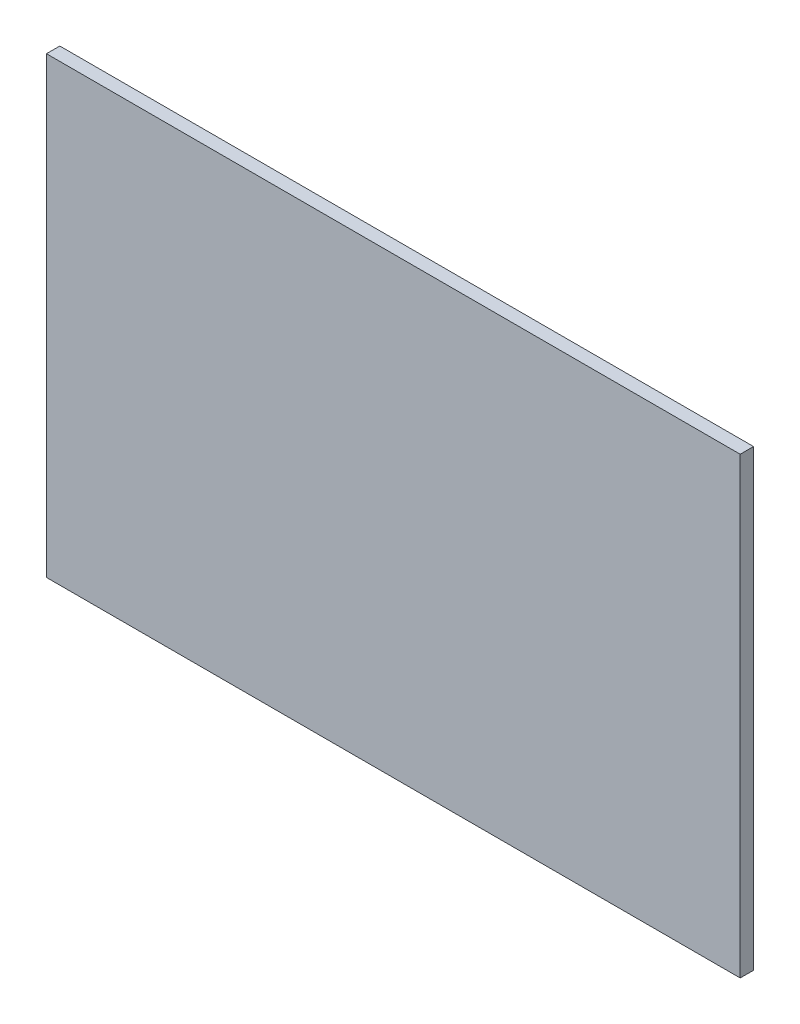
ISO-10303-21;
HEADER;
FILE_DESCRIPTION(('STEP AP214'),'2;1');
FILE_NAME('part.step','',(''),(''),'','','');
FILE_SCHEMA(('AUTOMOTIVE_DESIGN { 1 0 10303 214 1 1 1 1 }'));
ENDSEC;
DATA;
#1=APPLICATION_CONTEXT('core data for automotive mechanical design processes');
#2=APPLICATION_PROTOCOL_DEFINITION('international standard','automotive_design',2000,#1);
#3=PRODUCT_CONTEXT('',#1,'mechanical');
#4=PRODUCT('Part','Part','',(#3));
#5=PRODUCT_RELATED_PRODUCT_CATEGORY('part','',(#4));
#6=PRODUCT_DEFINITION_FORMATION('','',#4);
#7=PRODUCT_DEFINITION_CONTEXT('part definition',#1,'design');
#8=PRODUCT_DEFINITION('design','',#6,#7);
#9=PRODUCT_DEFINITION_SHAPE('','',#8);
#10=(LENGTH_UNIT() NAMED_UNIT(*) SI_UNIT(.MILLI.,.METRE.));
#11=(NAMED_UNIT(*) PLANE_ANGLE_UNIT() SI_UNIT($,.RADIAN.));
#12=(NAMED_UNIT(*) SI_UNIT($,.STERADIAN.) SOLID_ANGLE_UNIT());
#13=UNCERTAINTY_MEASURE_WITH_UNIT(LENGTH_MEASURE(1.E-05),#10,'distance_accuracy_value','');
#14=(GEOMETRIC_REPRESENTATION_CONTEXT(3) GLOBAL_UNCERTAINTY_ASSIGNED_CONTEXT((#13)) GLOBAL_UNIT_ASSIGNED_CONTEXT((#10,
#11,#12)) REPRESENTATION_CONTEXT('',''));
#15=CARTESIAN_POINT('',(0.,0.,0.));
#16=DIRECTION('',(0.,0.,1.));
#17=DIRECTION('',(1.,0.,0.));
#18=AXIS2_PLACEMENT_3D('',#15,#16,#17);
#19=CARTESIAN_POINT('',(99.06,64.77,3.81));
#20=DIRECTION('',(-1.,0.,0.));
#21=DIRECTION('',(0.,-1.,0.));
#22=AXIS2_PLACEMENT_3D('',#19,#20,#21);
#23=PLANE('',#22);
#24=DIRECTION('',(0.,1.,0.));
#25=VECTOR('',#24,1.);
#26=CARTESIAN_POINT('',(99.06,64.77,0.));
#27=LINE('',#26,#25);
#28=CARTESIAN_POINT('',(99.06,-64.77,0.));
#29=VERTEX_POINT('',#28);
#30=CARTESIAN_POINT('',(99.06,64.77,0.));
#31=VERTEX_POINT('',#30);
#32=EDGE_CURVE('E107',#29,#31,#27,.T.);
#33=ORIENTED_EDGE('',*,*,#32,.T.);
#34=DIRECTION('',(0.,0.,-1.));
#35=VECTOR('',#34,1.);
#36=CARTESIAN_POINT('',(99.06,64.77,3.81));
#37=LINE('',#36,#35);
#38=CARTESIAN_POINT('',(99.06,64.77,3.81));
#39=VERTEX_POINT('',#38);
#40=EDGE_CURVE('E11',#39,#31,#37,.T.);
#41=ORIENTED_EDGE('',*,*,#40,.F.);
#42=DIRECTION('',(0.,1.,0.));
#43=VECTOR('',#42,1.);
#44=CARTESIAN_POINT('',(99.06,64.77,3.81));
#45=LINE('',#44,#43);
#46=CARTESIAN_POINT('',(99.06,-64.77,3.81));
#47=VERTEX_POINT('',#46);
#48=EDGE_CURVE('E91',#47,#39,#45,.T.);
#49=ORIENTED_EDGE('',*,*,#48,.F.);
#50=DIRECTION('',(0.,0.,-1.));
#51=VECTOR('',#50,1.);
#52=CARTESIAN_POINT('',(99.06,-64.77,3.81));
#53=LINE('',#52,#51);
#54=EDGE_CURVE('E103',#47,#29,#53,.T.);
#55=ORIENTED_EDGE('',*,*,#54,.T.);
#56=EDGE_LOOP('',(#33,#41,#49,#55));
#57=FACE_BOUND('',#56,.T.);
#58=ADVANCED_FACE('F39',(#57),#23,.F.);
#59=CARTESIAN_POINT('',(-99.06,64.77,3.81));
#60=DIRECTION('',(0.,-1.,0.));
#61=DIRECTION('',(0.,0.,-1.));
#62=AXIS2_PLACEMENT_3D('',#59,#60,#61);
#63=PLANE('',#62);
#64=DIRECTION('',(-1.,0.,0.));
#65=VECTOR('',#64,1.);
#66=CARTESIAN_POINT('',(-99.06,64.77,0.));
#67=LINE('',#66,#65);
#68=CARTESIAN_POINT('',(-99.06,64.77,0.));
#69=VERTEX_POINT('',#68);
#70=EDGE_CURVE('E96',#31,#69,#67,.T.);
#71=ORIENTED_EDGE('',*,*,#70,.T.);
#72=DIRECTION('',(0.,0.,-1.));
#73=VECTOR('',#72,1.);
#74=CARTESIAN_POINT('',(-99.06,64.77,3.81));
#75=LINE('',#74,#73);
#76=CARTESIAN_POINT('',(-99.06,64.77,3.81));
#77=VERTEX_POINT('',#76);
#78=EDGE_CURVE('E48',#77,#69,#75,.T.);
#79=ORIENTED_EDGE('',*,*,#78,.F.);
#80=DIRECTION('',(-1.,0.,0.));
#81=VECTOR('',#80,1.);
#82=CARTESIAN_POINT('',(-99.06,64.77,3.81));
#83=LINE('',#82,#81);
#84=EDGE_CURVE('E86',#39,#77,#83,.T.);
#85=ORIENTED_EDGE('',*,*,#84,.F.);
#86=ORIENTED_EDGE('',*,*,#40,.T.);
#87=EDGE_LOOP('',(#71,#79,#85,#86));
#88=FACE_BOUND('',#87,.T.);
#89=ADVANCED_FACE('F95',(#88),#63,.F.);
#90=CARTESIAN_POINT('',(-99.06,64.77,3.81));
#91=DIRECTION('',(1.,0.,0.));
#92=DIRECTION('',(0.,1.,0.));
#93=AXIS2_PLACEMENT_3D('',#90,#91,#92);
#94=PLANE('',#93);
#95=DIRECTION('',(0.,-1.,0.));
#96=VECTOR('',#95,1.);
#97=CARTESIAN_POINT('',(-99.06,64.77,0.));
#98=LINE('',#97,#96);
#99=CARTESIAN_POINT('',(-99.06,-64.77,0.));
#100=VERTEX_POINT('',#99);
#101=EDGE_CURVE('E73',#69,#100,#98,.T.);
#102=ORIENTED_EDGE('',*,*,#101,.T.);
#103=DIRECTION('',(0.,0.,-1.));
#104=VECTOR('',#103,1.);
#105=CARTESIAN_POINT('',(-99.06,-64.77,3.81));
#106=LINE('',#105,#104);
#107=CARTESIAN_POINT('',(-99.06,-64.77,3.81));
#108=VERTEX_POINT('',#107);
#109=EDGE_CURVE('E98',#108,#100,#106,.T.);
#110=ORIENTED_EDGE('',*,*,#109,.F.);
#111=DIRECTION('',(0.,-1.,0.));
#112=VECTOR('',#111,1.);
#113=CARTESIAN_POINT('',(-99.06,64.77,3.81));
#114=LINE('',#113,#112);
#115=EDGE_CURVE('E89',#77,#108,#114,.T.);
#116=ORIENTED_EDGE('',*,*,#115,.F.);
#117=ORIENTED_EDGE('',*,*,#78,.T.);
#118=EDGE_LOOP('',(#102,#110,#116,#117));
#119=FACE_BOUND('',#118,.T.);
#120=ADVANCED_FACE('F99',(#119),#94,.F.);
#121=CARTESIAN_POINT('',(-99.06,-64.77,3.81));
#122=DIRECTION('',(0.,1.,0.));
#123=DIRECTION('',(0.,0.,1.));
#124=AXIS2_PLACEMENT_3D('',#121,#122,#123);
#125=PLANE('',#124);
#126=DIRECTION('',(1.,0.,0.));
#127=VECTOR('',#126,1.);
#128=CARTESIAN_POINT('',(-99.06,-64.77,0.));
#129=LINE('',#128,#127);
#130=EDGE_CURVE('E79',#100,#29,#129,.T.);
#131=ORIENTED_EDGE('',*,*,#130,.T.);
#132=ORIENTED_EDGE('',*,*,#54,.F.);
#133=DIRECTION('',(1.,0.,0.));
#134=VECTOR('',#133,1.);
#135=CARTESIAN_POINT('',(-99.06,-64.77,3.81));
#136=LINE('',#135,#134);
#137=EDGE_CURVE('E56',#108,#47,#136,.T.);
#138=ORIENTED_EDGE('',*,*,#137,.F.);
#139=ORIENTED_EDGE('',*,*,#109,.T.);
#140=EDGE_LOOP('',(#131,#132,#138,#139));
#141=FACE_BOUND('',#140,.T.);
#142=ADVANCED_FACE('F120',(#141),#125,.F.);
#143=CARTESIAN_POINT('',(0.,0.,3.81));
#144=DIRECTION('',(0.,0.,1.));
#145=DIRECTION('',(1.,0.,0.));
#146=AXIS2_PLACEMENT_3D('',#143,#144,#145);
#147=PLANE('',#146);
#148=ORIENTED_EDGE('',*,*,#48,.T.);
#149=ORIENTED_EDGE('',*,*,#84,.T.);
#150=ORIENTED_EDGE('',*,*,#115,.T.);
#151=ORIENTED_EDGE('',*,*,#137,.T.);
#152=EDGE_LOOP('',(#148,#149,#150,#151));
#153=FACE_BOUND('',#152,.T.);
#154=ADVANCED_FACE('F87',(#153),#147,.T.);
#155=CARTESIAN_POINT('',(0.,0.,0.));
#156=DIRECTION('',(0.,0.,1.));
#157=DIRECTION('',(1.,0.,0.));
#158=AXIS2_PLACEMENT_3D('',#155,#156,#157);
#159=PLANE('',#158);
#160=ORIENTED_EDGE('',*,*,#32,.F.);
#161=ORIENTED_EDGE('',*,*,#130,.F.);
#162=ORIENTED_EDGE('',*,*,#101,.F.);
#163=ORIENTED_EDGE('',*,*,#70,.F.);
#164=EDGE_LOOP('',(#160,#161,#162,#163));
#165=FACE_BOUND('',#164,.T.);
#166=ADVANCED_FACE('F123',(#165),#159,.F.);
#167=CLOSED_SHELL('',(#58,#89,#120,#142,#154,#166));
#168=MANIFOLD_SOLID_BREP('B2',#167);
#169=ADVANCED_BREP_SHAPE_REPRESENTATION('',(#18,#168),#14);
#170=SHAPE_DEFINITION_REPRESENTATION(#9,#169);
ENDSEC;
END-ISO-10303-21;
